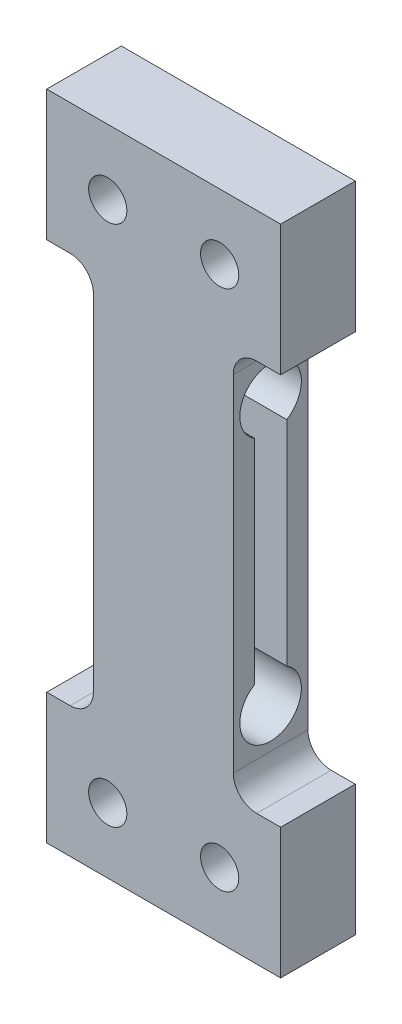
ISO-10303-21;
HEADER;
FILE_DESCRIPTION(('STEP AP214'),'2;1');
FILE_NAME('part.step','',(''),(''),'','','');
FILE_SCHEMA(('AUTOMOTIVE_DESIGN { 1 0 10303 214 1 1 1 1 }'));
ENDSEC;
DATA;
#1=APPLICATION_CONTEXT('core data for automotive mechanical design processes');
#2=APPLICATION_PROTOCOL_DEFINITION('international standard','automotive_design',2000,#1);
#3=PRODUCT_CONTEXT('',#1,'mechanical');
#4=PRODUCT('Part','Part','',(#3));
#5=PRODUCT_RELATED_PRODUCT_CATEGORY('part','',(#4));
#6=PRODUCT_DEFINITION_FORMATION('','',#4);
#7=PRODUCT_DEFINITION_CONTEXT('part definition',#1,'design');
#8=PRODUCT_DEFINITION('design','',#6,#7);
#9=PRODUCT_DEFINITION_SHAPE('','',#8);
#10=(LENGTH_UNIT() NAMED_UNIT(*) SI_UNIT(.MILLI.,.METRE.));
#11=(NAMED_UNIT(*) PLANE_ANGLE_UNIT() SI_UNIT($,.RADIAN.));
#12=(NAMED_UNIT(*) SI_UNIT($,.STERADIAN.) SOLID_ANGLE_UNIT());
#13=UNCERTAINTY_MEASURE_WITH_UNIT(LENGTH_MEASURE(1.E-05),#10,'distance_accuracy_value','');
#14=(GEOMETRIC_REPRESENTATION_CONTEXT(3) GLOBAL_UNCERTAINTY_ASSIGNED_CONTEXT((#13)) GLOBAL_UNIT_ASSIGNED_CONTEXT((#10,
#11,#12)) REPRESENTATION_CONTEXT('',''));
#15=CARTESIAN_POINT('',(0.,0.,0.));
#16=DIRECTION('',(0.,0.,1.));
#17=DIRECTION('',(1.,0.,0.));
#18=AXIS2_PLACEMENT_3D('',#15,#16,#17);
#19=CARTESIAN_POINT('',(2.53843426704407,0.,0.));
#20=DIRECTION('',(1.,0.,0.));
#21=DIRECTION('',(0.,0.,-1.));
#22=AXIS2_PLACEMENT_3D('',#19,#20,#21);
#23=PLANE('',#22);
#24=DIRECTION('',(0.,0.,-1.));
#25=VECTOR('',#24,1.);
#26=CARTESIAN_POINT('',(2.53843426704407,28.,4.));
#27=LINE('',#26,#25);
#28=CARTESIAN_POINT('',(2.53843426704407,28.,4.));
#29=VERTEX_POINT('',#28);
#30=CARTESIAN_POINT('',(2.53843426704407,28.,0.));
#31=VERTEX_POINT('',#30);
#32=EDGE_CURVE('E223',#29,#31,#27,.T.);
#33=ORIENTED_EDGE('',*,*,#32,.T.);
#34=DIRECTION('',(0.,1.,0.));
#35=VECTOR('',#34,1.);
#36=CARTESIAN_POINT('',(2.53843426704407,0.,0.));
#37=LINE('',#36,#35);
#38=CARTESIAN_POINT('',(2.53843426704407,35.,0.));
#39=VERTEX_POINT('',#38);
#40=EDGE_CURVE('E260',#31,#39,#37,.T.);
#41=ORIENTED_EDGE('',*,*,#40,.T.);
#42=DIRECTION('',(0.,0.,1.));
#43=VECTOR('',#42,1.);
#44=CARTESIAN_POINT('',(2.53843426704407,35.,0.));
#45=LINE('',#44,#43);
#46=CARTESIAN_POINT('',(2.53843426704407,35.,4.));
#47=VERTEX_POINT('',#46);
#48=EDGE_CURVE('E277',#39,#47,#45,.T.);
#49=ORIENTED_EDGE('',*,*,#48,.T.);
#50=DIRECTION('',(0.,1.,0.));
#51=VECTOR('',#50,1.);
#52=CARTESIAN_POINT('',(2.53843426704407,0.,4.));
#53=LINE('',#52,#51);
#54=EDGE_CURVE('E274',#29,#47,#53,.T.);
#55=ORIENTED_EDGE('',*,*,#54,.F.);
#56=EDGE_LOOP('',(#33,#41,#49,#55));
#57=FACE_BOUND('',#56,.T.);
#58=ADVANCED_FACE('F37',(#57),#23,.T.);
#59=CARTESIAN_POINT('',(-10.,35.,0.));
#60=DIRECTION('',(-1.,0.,0.));
#61=DIRECTION('',(0.,0.,1.));
#62=AXIS2_PLACEMENT_3D('',#59,#60,#61);
#63=PLANE('',#62);
#64=DIRECTION('',(0.,0.,-1.));
#65=VECTOR('',#64,1.);
#66=CARTESIAN_POINT('',(-10.,7.,4.));
#67=LINE('',#66,#65);
#68=CARTESIAN_POINT('',(-10.,7.,4.));
#69=VERTEX_POINT('',#68);
#70=CARTESIAN_POINT('',(-10.,7.,0.));
#71=VERTEX_POINT('',#70);
#72=EDGE_CURVE('E244',#69,#71,#67,.T.);
#73=ORIENTED_EDGE('',*,*,#72,.T.);
#74=DIRECTION('',(0.,-1.,0.));
#75=VECTOR('',#74,1.);
#76=CARTESIAN_POINT('',(-10.,35.,0.));
#77=LINE('',#76,#75);
#78=CARTESIAN_POINT('',(-10.,0.,0.));
#79=VERTEX_POINT('',#78);
#80=EDGE_CURVE('E252',#71,#79,#77,.T.);
#81=ORIENTED_EDGE('',*,*,#80,.T.);
#82=DIRECTION('',(0.,0.,1.));
#83=VECTOR('',#82,1.);
#84=CARTESIAN_POINT('',(-10.,0.,0.));
#85=LINE('',#84,#83);
#86=CARTESIAN_POINT('',(-10.,0.,4.));
#87=VERTEX_POINT('',#86);
#88=EDGE_CURVE('E283',#79,#87,#85,.T.);
#89=ORIENTED_EDGE('',*,*,#88,.T.);
#90=DIRECTION('',(0.,-1.,0.));
#91=VECTOR('',#90,1.);
#92=CARTESIAN_POINT('',(-10.,35.,4.));
#93=LINE('',#92,#91);
#94=EDGE_CURVE('E267',#69,#87,#93,.T.);
#95=ORIENTED_EDGE('',*,*,#94,.F.);
#96=EDGE_LOOP('',(#73,#81,#89,#95));
#97=FACE_BOUND('',#96,.T.);
#98=ADVANCED_FACE('F357',(#97),#63,.T.);
#99=CARTESIAN_POINT('',(2.53843426704407,35.,0.));
#100=DIRECTION('',(0.,1.,0.));
#101=DIRECTION('',(0.,0.,1.));
#102=AXIS2_PLACEMENT_3D('',#99,#100,#101);
#103=PLANE('',#102);
#104=DIRECTION('',(-1.,0.,0.));
#105=VECTOR('',#104,1.);
#106=CARTESIAN_POINT('',(2.53843426704407,35.,4.));
#107=LINE('',#106,#105);
#108=CARTESIAN_POINT('',(-10.,35.,4.));
#109=VERTEX_POINT('',#108);
#110=EDGE_CURVE('E247',#47,#109,#107,.T.);
#111=ORIENTED_EDGE('',*,*,#110,.F.);
#112=ORIENTED_EDGE('',*,*,#48,.F.);
#113=DIRECTION('',(-1.,0.,0.));
#114=VECTOR('',#113,1.);
#115=CARTESIAN_POINT('',(2.53843426704407,35.,0.));
#116=LINE('',#115,#114);
#117=CARTESIAN_POINT('',(-10.,35.,0.));
#118=VERTEX_POINT('',#117);
#119=EDGE_CURVE('E249',#39,#118,#116,.T.);
#120=ORIENTED_EDGE('',*,*,#119,.T.);
#121=DIRECTION('',(0.,0.,1.));
#122=VECTOR('',#121,1.);
#123=CARTESIAN_POINT('',(-10.,35.,0.));
#124=LINE('',#123,#122);
#125=EDGE_CURVE('E264',#118,#109,#124,.T.);
#126=ORIENTED_EDGE('',*,*,#125,.T.);
#127=EDGE_LOOP('',(#111,#112,#120,#126));
#128=FACE_BOUND('',#127,.T.);
#129=ADVANCED_FACE('F385',(#128),#103,.T.);
#130=DIRECTION('',(0.,0.,-1.));
#131=VECTOR('',#130,1.);
#132=CARTESIAN_POINT('',(2.53843426704407,7.,4.));
#133=LINE('',#132,#131);
#134=CARTESIAN_POINT('',(2.53843426704407,7.,4.));
#135=VERTEX_POINT('',#134);
#136=CARTESIAN_POINT('',(2.53843426704407,7.,0.));
#137=VERTEX_POINT('',#136);
#138=EDGE_CURVE('E217',#135,#137,#133,.T.);
#139=ORIENTED_EDGE('',*,*,#138,.F.);
#140=CARTESIAN_POINT('',(2.53843426704407,0.,4.));
#141=VERTEX_POINT('',#140);
#142=EDGE_CURVE('E253',#141,#135,#53,.T.);
#143=ORIENTED_EDGE('',*,*,#142,.F.);
#144=DIRECTION('',(0.,0.,1.));
#145=VECTOR('',#144,1.);
#146=CARTESIAN_POINT('',(2.53843426704407,0.,0.));
#147=LINE('',#146,#145);
#148=CARTESIAN_POINT('',(2.53843426704407,0.,0.));
#149=VERTEX_POINT('',#148);
#150=EDGE_CURVE('E281',#149,#141,#147,.T.);
#151=ORIENTED_EDGE('',*,*,#150,.F.);
#152=EDGE_CURVE('E261',#149,#137,#37,.T.);
#153=ORIENTED_EDGE('',*,*,#152,.T.);
#154=EDGE_LOOP('',(#139,#143,#151,#153));
#155=FACE_BOUND('',#154,.T.);
#156=ADVANCED_FACE('F346',(#155),#23,.T.);
#157=CARTESIAN_POINT('',(-10.,0.,0.));
#158=DIRECTION('',(0.,-1.,0.));
#159=DIRECTION('',(0.,0.,-1.));
#160=AXIS2_PLACEMENT_3D('',#157,#158,#159);
#161=PLANE('',#160);
#162=DIRECTION('',(1.,0.,0.));
#163=VECTOR('',#162,1.);
#164=CARTESIAN_POINT('',(-10.,0.,4.));
#165=LINE('',#164,#163);
#166=EDGE_CURVE('E271',#87,#141,#165,.T.);
#167=ORIENTED_EDGE('',*,*,#166,.F.);
#168=ORIENTED_EDGE('',*,*,#88,.F.);
#169=DIRECTION('',(1.,0.,0.));
#170=VECTOR('',#169,1.);
#171=CARTESIAN_POINT('',(-10.,0.,0.));
#172=LINE('',#171,#170);
#173=EDGE_CURVE('E257',#79,#149,#172,.T.);
#174=ORIENTED_EDGE('',*,*,#173,.T.);
#175=ORIENTED_EDGE('',*,*,#150,.T.);
#176=EDGE_LOOP('',(#167,#168,#174,#175));
#177=FACE_BOUND('',#176,.T.);
#178=ADVANCED_FACE('F354',(#177),#161,.T.);
#179=DIRECTION('',(0.,0.,-1.));
#180=VECTOR('',#179,1.);
#181=CARTESIAN_POINT('',(-10.,28.,4.));
#182=LINE('',#181,#180);
#183=CARTESIAN_POINT('',(-10.,28.,4.));
#184=VERTEX_POINT('',#183);
#185=CARTESIAN_POINT('',(-10.,28.,0.));
#186=VERTEX_POINT('',#185);
#187=EDGE_CURVE('E237',#184,#186,#182,.T.);
#188=ORIENTED_EDGE('',*,*,#187,.F.);
#189=EDGE_CURVE('E268',#109,#184,#93,.T.);
#190=ORIENTED_EDGE('',*,*,#189,.F.);
#191=ORIENTED_EDGE('',*,*,#125,.F.);
#192=EDGE_CURVE('E254',#118,#186,#77,.T.);
#193=ORIENTED_EDGE('',*,*,#192,.T.);
#194=EDGE_LOOP('',(#188,#190,#191,#193));
#195=FACE_BOUND('',#194,.T.);
#196=ADVANCED_FACE('F381',(#195),#63,.T.);
#197=CARTESIAN_POINT('',(-10.,35.,0.));
#198=DIRECTION('',(0.,0.,1.));
#199=DIRECTION('',(1.,0.,0.));
#200=AXIS2_PLACEMENT_3D('',#197,#198,#199);
#201=PLANE('',#200);
#202=CARTESIAN_POINT('',(-0.730782866478019,3.49999999999998,0.));
#203=DIRECTION('',(0.,0.,1.));
#204=DIRECTION('',(1.,0.,0.));
#205=AXIS2_PLACEMENT_3D('',#202,#203,#204);
#206=CIRCLE('',#205,1.025);
#207=CARTESIAN_POINT('',(0.29421713352198,3.49999999999998,0.));
#208=VERTEX_POINT('',#207);
#209=EDGE_CURVE('E631',#208,#208,#206,.T.);
#210=ORIENTED_EDGE('',*,*,#209,.T.);
#211=EDGE_LOOP('',(#210));
#212=FACE_BOUND('',#211,.T.);
#213=CARTESIAN_POINT('',(-6.73078286647802,3.5,0.));
#214=DIRECTION('',(0.,0.,1.));
#215=DIRECTION('',(1.,0.,0.));
#216=AXIS2_PLACEMENT_3D('',#213,#214,#215);
#217=CIRCLE('',#216,1.025);
#218=CARTESIAN_POINT('',(-5.70578286647802,3.5,0.));
#219=VERTEX_POINT('',#218);
#220=EDGE_CURVE('E625',#219,#219,#217,.T.);
#221=ORIENTED_EDGE('',*,*,#220,.T.);
#222=EDGE_LOOP('',(#221));
#223=FACE_BOUND('',#222,.T.);
#224=CARTESIAN_POINT('',(-0.730782866478016,31.5,0.));
#225=DIRECTION('',(0.,0.,1.));
#226=DIRECTION('',(1.,0.,0.));
#227=AXIS2_PLACEMENT_3D('',#224,#225,#226);
#228=CIRCLE('',#227,1.025);
#229=CARTESIAN_POINT('',(0.294217133521983,31.5,0.));
#230=VERTEX_POINT('',#229);
#231=EDGE_CURVE('E619',#230,#230,#228,.T.);
#232=ORIENTED_EDGE('',*,*,#231,.T.);
#233=EDGE_LOOP('',(#232));
#234=FACE_BOUND('',#233,.T.);
#235=CARTESIAN_POINT('',(-6.73078286647802,31.5,0.));
#236=DIRECTION('',(0.,0.,1.));
#237=DIRECTION('',(1.,0.,0.));
#238=AXIS2_PLACEMENT_3D('',#235,#236,#237);
#239=CIRCLE('',#238,1.025);
#240=CARTESIAN_POINT('',(-5.70578286647802,31.5,0.));
#241=VERTEX_POINT('',#240);
#242=EDGE_CURVE('E195',#241,#241,#239,.T.);
#243=ORIENTED_EDGE('',*,*,#242,.T.);
#244=EDGE_LOOP('',(#243));
#245=FACE_BOUND('',#244,.T.);
#246=ORIENTED_EDGE('',*,*,#40,.F.);
#247=DIRECTION('',(1.,0.,0.));
#248=VECTOR('',#247,1.);
#249=CARTESIAN_POINT('',(0.,28.,0.));
#250=LINE('',#249,#248);
#251=CARTESIAN_POINT('',(1.25,28.,0.));
#252=VERTEX_POINT('',#251);
#253=EDGE_CURVE('E212',#252,#31,#250,.T.);
#254=ORIENTED_EDGE('',*,*,#253,.F.);
#255=CARTESIAN_POINT('',(1.25,26.75,0.));
#256=DIRECTION('',(0.,0.,1.));
#257=DIRECTION('',(1.,0.,0.));
#258=AXIS2_PLACEMENT_3D('',#255,#256,#257);
#259=CIRCLE('',#258,1.25);
#260=CARTESIAN_POINT('',(0.,26.75,0.));
#261=VERTEX_POINT('',#260);
#262=EDGE_CURVE('E318',#252,#261,#259,.T.);
#263=ORIENTED_EDGE('',*,*,#262,.T.);
#264=DIRECTION('',(0.,1.,0.));
#265=VECTOR('',#264,1.);
#266=CARTESIAN_POINT('',(0.,6.99999999999999,0.));
#267=LINE('',#266,#265);
#268=CARTESIAN_POINT('',(0.,8.24999999999999,0.));
#269=VERTEX_POINT('',#268);
#270=EDGE_CURVE('E219',#269,#261,#267,.T.);
#271=ORIENTED_EDGE('',*,*,#270,.F.);
#272=CARTESIAN_POINT('',(1.25,8.24999999999999,0.));
#273=DIRECTION('',(0.,0.,1.));
#274=DIRECTION('',(1.,0.,0.));
#275=AXIS2_PLACEMENT_3D('',#272,#273,#274);
#276=CIRCLE('',#275,1.25);
#277=CARTESIAN_POINT('',(1.25,7.,0.));
#278=VERTEX_POINT('',#277);
#279=EDGE_CURVE('E45',#269,#278,#276,.T.);
#280=ORIENTED_EDGE('',*,*,#279,.T.);
#281=DIRECTION('',(-1.,0.,0.));
#282=VECTOR('',#281,1.);
#283=CARTESIAN_POINT('',(2.53843426704407,7.,0.));
#284=LINE('',#283,#282);
#285=EDGE_CURVE('E183',#137,#278,#284,.T.);
#286=ORIENTED_EDGE('',*,*,#285,.F.);
#287=ORIENTED_EDGE('',*,*,#152,.F.);
#288=ORIENTED_EDGE('',*,*,#173,.F.);
#289=ORIENTED_EDGE('',*,*,#80,.F.);
#290=DIRECTION('',(-1.,0.,0.));
#291=VECTOR('',#290,1.);
#292=CARTESIAN_POINT('',(-7.5,6.99999999999999,0.));
#293=LINE('',#292,#291);
#294=CARTESIAN_POINT('',(-8.75000000000001,6.99999999999999,0.));
#295=VERTEX_POINT('',#294);
#296=EDGE_CURVE('E232',#295,#71,#293,.T.);
#297=ORIENTED_EDGE('',*,*,#296,.F.);
#298=CARTESIAN_POINT('',(-8.75,8.24999999999999,0.));
#299=DIRECTION('',(0.,0.,1.));
#300=DIRECTION('',(1.,0.,0.));
#301=AXIS2_PLACEMENT_3D('',#298,#299,#300);
#302=CIRCLE('',#301,1.25);
#303=CARTESIAN_POINT('',(-7.5,8.24999999999999,0.));
#304=VERTEX_POINT('',#303);
#305=EDGE_CURVE('E314',#295,#304,#302,.T.);
#306=ORIENTED_EDGE('',*,*,#305,.T.);
#307=DIRECTION('',(0.,-1.,0.));
#308=VECTOR('',#307,1.);
#309=CARTESIAN_POINT('',(-7.5,28.,0.));
#310=LINE('',#309,#308);
#311=CARTESIAN_POINT('',(-7.5,26.75,0.));
#312=VERTEX_POINT('',#311);
#313=EDGE_CURVE('E240',#312,#304,#310,.T.);
#314=ORIENTED_EDGE('',*,*,#313,.F.);
#315=CARTESIAN_POINT('',(-8.75,26.75,0.));
#316=DIRECTION('',(0.,0.,1.));
#317=DIRECTION('',(1.,0.,0.));
#318=AXIS2_PLACEMENT_3D('',#315,#316,#317);
#319=CIRCLE('',#318,1.25);
#320=CARTESIAN_POINT('',(-8.74999999999999,28.,0.));
#321=VERTEX_POINT('',#320);
#322=EDGE_CURVE('E310',#312,#321,#319,.T.);
#323=ORIENTED_EDGE('',*,*,#322,.T.);
#324=DIRECTION('',(1.,0.,0.));
#325=VECTOR('',#324,1.);
#326=CARTESIAN_POINT('',(-10.,28.,0.));
#327=LINE('',#326,#325);
#328=EDGE_CURVE('E226',#186,#321,#327,.T.);
#329=ORIENTED_EDGE('',*,*,#328,.F.);
#330=ORIENTED_EDGE('',*,*,#192,.F.);
#331=ORIENTED_EDGE('',*,*,#119,.F.);
#332=EDGE_LOOP('',(#246,#254,#263,#271,#280,#286,#287,#288,#289,#297,#306,#314,#323,#329,#330,#331));
#333=FACE_BOUND('',#332,.T.);
#334=ADVANCED_FACE('F336',(#212,#223,#234,#245,#333),#201,.F.);
#335=CARTESIAN_POINT('',(-10.,35.,4.));
#336=DIRECTION('',(0.,0.,1.));
#337=DIRECTION('',(1.,0.,0.));
#338=AXIS2_PLACEMENT_3D('',#335,#336,#337);
#339=PLANE('',#338);
#340=CARTESIAN_POINT('',(-0.730782866478019,3.49999999999998,4.));
#341=DIRECTION('',(0.,0.,1.));
#342=DIRECTION('',(1.,0.,0.));
#343=AXIS2_PLACEMENT_3D('',#340,#341,#342);
#344=CIRCLE('',#343,1.02499999999999);
#345=CARTESIAN_POINT('',(0.294217133521969,3.49999999999998,4.));
#346=VERTEX_POINT('',#345);
#347=EDGE_CURVE('E634',#346,#346,#344,.T.);
#348=ORIENTED_EDGE('',*,*,#347,.F.);
#349=EDGE_LOOP('',(#348));
#350=FACE_BOUND('',#349,.T.);
#351=CARTESIAN_POINT('',(-6.73078286647802,3.5,4.));
#352=DIRECTION('',(0.,0.,1.));
#353=DIRECTION('',(1.,0.,0.));
#354=AXIS2_PLACEMENT_3D('',#351,#352,#353);
#355=CIRCLE('',#354,1.02499999999999);
#356=CARTESIAN_POINT('',(-5.70578286647803,3.5,4.));
#357=VERTEX_POINT('',#356);
#358=EDGE_CURVE('E628',#357,#357,#355,.T.);
#359=ORIENTED_EDGE('',*,*,#358,.F.);
#360=EDGE_LOOP('',(#359));
#361=FACE_BOUND('',#360,.T.);
#362=CARTESIAN_POINT('',(-0.730782866478016,31.5,4.));
#363=DIRECTION('',(0.,0.,1.));
#364=DIRECTION('',(1.,0.,0.));
#365=AXIS2_PLACEMENT_3D('',#362,#363,#364);
#366=CIRCLE('',#365,1.02499999999999);
#367=CARTESIAN_POINT('',(0.294217133521972,31.5,4.));
#368=VERTEX_POINT('',#367);
#369=EDGE_CURVE('E622',#368,#368,#366,.T.);
#370=ORIENTED_EDGE('',*,*,#369,.F.);
#371=EDGE_LOOP('',(#370));
#372=FACE_BOUND('',#371,.T.);
#373=CARTESIAN_POINT('',(-6.73078286647802,31.5,4.));
#374=DIRECTION('',(0.,0.,1.));
#375=DIRECTION('',(1.,0.,0.));
#376=AXIS2_PLACEMENT_3D('',#373,#374,#375);
#377=CIRCLE('',#376,1.02499999999999);
#378=CARTESIAN_POINT('',(-5.70578286647803,31.5,4.));
#379=VERTEX_POINT('',#378);
#380=EDGE_CURVE('E616',#379,#379,#377,.T.);
#381=ORIENTED_EDGE('',*,*,#380,.F.);
#382=EDGE_LOOP('',(#381));
#383=FACE_BOUND('',#382,.T.);
#384=DIRECTION('',(0.,1.,0.));
#385=VECTOR('',#384,1.);
#386=CARTESIAN_POINT('',(0.,6.99999999999999,4.));
#387=LINE('',#386,#385);
#388=CARTESIAN_POINT('',(0.,8.24999999999999,4.));
#389=VERTEX_POINT('',#388);
#390=CARTESIAN_POINT('',(0.,26.75,4.));
#391=VERTEX_POINT('',#390);
#392=EDGE_CURVE('E211',#389,#391,#387,.T.);
#393=ORIENTED_EDGE('',*,*,#392,.T.);
#394=CARTESIAN_POINT('',(1.25,26.75,4.));
#395=DIRECTION('',(0.,0.,1.));
#396=DIRECTION('',(1.,0.,0.));
#397=AXIS2_PLACEMENT_3D('',#394,#395,#396);
#398=CIRCLE('',#397,1.25);
#399=CARTESIAN_POINT('',(1.25,28.,4.));
#400=VERTEX_POINT('',#399);
#401=EDGE_CURVE('E320',#391,#400,#398,.F.);
#402=ORIENTED_EDGE('',*,*,#401,.T.);
#403=DIRECTION('',(1.,0.,0.));
#404=VECTOR('',#403,1.);
#405=CARTESIAN_POINT('',(0.,28.,4.));
#406=LINE('',#405,#404);
#407=EDGE_CURVE('E215',#400,#29,#406,.T.);
#408=ORIENTED_EDGE('',*,*,#407,.T.);
#409=ORIENTED_EDGE('',*,*,#54,.T.);
#410=ORIENTED_EDGE('',*,*,#110,.T.);
#411=ORIENTED_EDGE('',*,*,#189,.T.);
#412=DIRECTION('',(1.,0.,0.));
#413=VECTOR('',#412,1.);
#414=CARTESIAN_POINT('',(-10.,28.,4.));
#415=LINE('',#414,#413);
#416=CARTESIAN_POINT('',(-8.74999999999999,28.,4.));
#417=VERTEX_POINT('',#416);
#418=EDGE_CURVE('E228',#184,#417,#415,.T.);
#419=ORIENTED_EDGE('',*,*,#418,.T.);
#420=CARTESIAN_POINT('',(-8.75,26.75,4.));
#421=DIRECTION('',(0.,0.,1.));
#422=DIRECTION('',(1.,0.,0.));
#423=AXIS2_PLACEMENT_3D('',#420,#421,#422);
#424=CIRCLE('',#423,1.25);
#425=CARTESIAN_POINT('',(-7.5,26.75,4.));
#426=VERTEX_POINT('',#425);
#427=EDGE_CURVE('E312',#417,#426,#424,.F.);
#428=ORIENTED_EDGE('',*,*,#427,.T.);
#429=DIRECTION('',(0.,-1.,0.));
#430=VECTOR('',#429,1.);
#431=CARTESIAN_POINT('',(-7.5,28.,4.));
#432=LINE('',#431,#430);
#433=CARTESIAN_POINT('',(-7.5,8.24999999999999,4.));
#434=VERTEX_POINT('',#433);
#435=EDGE_CURVE('E231',#426,#434,#432,.T.);
#436=ORIENTED_EDGE('',*,*,#435,.T.);
#437=CARTESIAN_POINT('',(-8.75,8.24999999999999,4.));
#438=DIRECTION('',(0.,0.,1.));
#439=DIRECTION('',(1.,0.,0.));
#440=AXIS2_PLACEMENT_3D('',#437,#438,#439);
#441=CIRCLE('',#440,1.25);
#442=CARTESIAN_POINT('',(-8.75000000000001,6.99999999999999,4.));
#443=VERTEX_POINT('',#442);
#444=EDGE_CURVE('E316',#434,#443,#441,.F.);
#445=ORIENTED_EDGE('',*,*,#444,.T.);
#446=DIRECTION('',(-1.,0.,0.));
#447=VECTOR('',#446,1.);
#448=CARTESIAN_POINT('',(-7.5,6.99999999999999,4.));
#449=LINE('',#448,#447);
#450=EDGE_CURVE('E235',#443,#69,#449,.T.);
#451=ORIENTED_EDGE('',*,*,#450,.T.);
#452=ORIENTED_EDGE('',*,*,#94,.T.);
#453=ORIENTED_EDGE('',*,*,#166,.T.);
#454=ORIENTED_EDGE('',*,*,#142,.T.);
#455=DIRECTION('',(-1.,0.,0.));
#456=VECTOR('',#455,1.);
#457=CARTESIAN_POINT('',(2.53843426704407,7.,4.));
#458=LINE('',#457,#456);
#459=CARTESIAN_POINT('',(1.25,7.,4.));
#460=VERTEX_POINT('',#459);
#461=EDGE_CURVE('E209',#135,#460,#458,.T.);
#462=ORIENTED_EDGE('',*,*,#461,.T.);
#463=CARTESIAN_POINT('',(1.25,8.24999999999999,4.));
#464=DIRECTION('',(0.,0.,1.));
#465=DIRECTION('',(1.,0.,0.));
#466=AXIS2_PLACEMENT_3D('',#463,#464,#465);
#467=CIRCLE('',#466,1.25);
#468=EDGE_CURVE('E11',#460,#389,#467,.F.);
#469=ORIENTED_EDGE('',*,*,#468,.T.);
#470=EDGE_LOOP('',(#393,#402,#408,#409,#410,#411,#419,#428,#436,#445,#451,#452,#453,#454,#462,#469));
#471=FACE_BOUND('',#470,.T.);
#472=ADVANCED_FACE('F324',(#350,#361,#372,#383,#471),#339,.T.);
#473=CARTESIAN_POINT('',(-7.5,6.99999999999999,4.));
#474=DIRECTION('',(0.,-1.,0.));
#475=DIRECTION('',(1.,0.,0.));
#476=AXIS2_PLACEMENT_3D('',#473,#474,#475);
#477=PLANE('',#476);
#478=ORIENTED_EDGE('',*,*,#450,.F.);
#479=DIRECTION('',(0.,0.,-1.));
#480=VECTOR('',#479,1.);
#481=CARTESIAN_POINT('',(-8.75000000000001,6.99999999999999,0.));
#482=LINE('',#481,#480);
#483=EDGE_CURVE('E298',#443,#295,#482,.T.);
#484=ORIENTED_EDGE('',*,*,#483,.T.);
#485=ORIENTED_EDGE('',*,*,#296,.T.);
#486=ORIENTED_EDGE('',*,*,#72,.F.);
#487=EDGE_LOOP('',(#478,#484,#485,#486));
#488=FACE_BOUND('',#487,.T.);
#489=ADVANCED_FACE('F361',(#488),#477,.F.);
#490=CARTESIAN_POINT('',(-7.5,28.,4.));
#491=DIRECTION('',(1.,0.,0.));
#492=DIRECTION('',(0.,1.,0.));
#493=AXIS2_PLACEMENT_3D('',#490,#491,#492);
#494=PLANE('',#493);
#495=DIRECTION('',(0.,1.,0.));
#496=VECTOR('',#495,1.);
#497=CARTESIAN_POINT('',(-7.5,11.7856301404825,2.85593376306963));
#498=LINE('',#497,#496);
#499=CARTESIAN_POINT('',(-7.5,11.7856301404825,2.85593376306963));
#500=VERTEX_POINT('',#499);
#501=CARTESIAN_POINT('',(-7.5,23.2143698595176,2.85593376306961));
#502=VERTEX_POINT('',#501);
#503=EDGE_CURVE('E194',#500,#502,#498,.T.);
#504=ORIENTED_EDGE('',*,*,#503,.F.);
#505=CARTESIAN_POINT('',(-7.5,10.375,2.));
#506=DIRECTION('',(-1.,0.,0.));
#507=DIRECTION('',(0.,0.,1.));
#508=AXIS2_PLACEMENT_3D('',#505,#506,#507);
#509=CIRCLE('',#508,1.65000000000002);
#510=CARTESIAN_POINT('',(-7.5,11.7781326807042,1.13183026985506));
#511=VERTEX_POINT('',#510);
#512=EDGE_CURVE('E175',#511,#500,#509,.T.);
#513=ORIENTED_EDGE('',*,*,#512,.F.);
#514=DIRECTION('',(0.,-1.,0.));
#515=VECTOR('',#514,1.);
#516=CARTESIAN_POINT('',(-7.5,23.2218673192958,1.13183026985509));
#517=LINE('',#516,#515);
#518=CARTESIAN_POINT('',(-7.5,23.2218673192958,1.13183026985507));
#519=VERTEX_POINT('',#518);
#520=EDGE_CURVE('E192',#519,#511,#517,.T.);
#521=ORIENTED_EDGE('',*,*,#520,.F.);
#522=CARTESIAN_POINT('',(-7.5,24.625,2.));
#523=DIRECTION('',(-1.,0.,0.));
#524=DIRECTION('',(0.,0.,1.));
#525=AXIS2_PLACEMENT_3D('',#522,#523,#524);
#526=CIRCLE('',#525,1.65000000000001);
#527=EDGE_CURVE('E609',#502,#519,#526,.T.);
#528=ORIENTED_EDGE('',*,*,#527,.F.);
#529=EDGE_LOOP('',(#504,#513,#521,#528));
#530=FACE_BOUND('',#529,.T.);
#531=ORIENTED_EDGE('',*,*,#435,.F.);
#532=DIRECTION('',(0.,0.,-1.));
#533=VECTOR('',#532,1.);
#534=CARTESIAN_POINT('',(-7.5,26.75,0.));
#535=LINE('',#534,#533);
#536=EDGE_CURVE('E293',#426,#312,#535,.T.);
#537=ORIENTED_EDGE('',*,*,#536,.T.);
#538=ORIENTED_EDGE('',*,*,#313,.T.);
#539=DIRECTION('',(0.,0.,-1.));
#540=VECTOR('',#539,1.);
#541=CARTESIAN_POINT('',(-7.5,8.24999999999999,4.));
#542=LINE('',#541,#540);
#543=EDGE_CURVE('E291',#304,#434,#542,.F.);
#544=ORIENTED_EDGE('',*,*,#543,.T.);
#545=EDGE_LOOP('',(#531,#537,#538,#544));
#546=FACE_BOUND('',#545,.T.);
#547=ADVANCED_FACE('F189',(#530,#546),#494,.F.);
#548=CARTESIAN_POINT('',(-10.,28.,4.));
#549=DIRECTION('',(0.,1.,0.));
#550=DIRECTION('',(-1.,0.,0.));
#551=AXIS2_PLACEMENT_3D('',#548,#549,#550);
#552=PLANE('',#551);
#553=ORIENTED_EDGE('',*,*,#328,.T.);
#554=DIRECTION('',(0.,0.,-1.));
#555=VECTOR('',#554,1.);
#556=CARTESIAN_POINT('',(-8.74999999999999,28.,4.));
#557=LINE('',#556,#555);
#558=EDGE_CURVE('E296',#321,#417,#557,.F.);
#559=ORIENTED_EDGE('',*,*,#558,.T.);
#560=ORIENTED_EDGE('',*,*,#418,.F.);
#561=ORIENTED_EDGE('',*,*,#187,.T.);
#562=EDGE_LOOP('',(#553,#559,#560,#561));
#563=FACE_BOUND('',#562,.T.);
#564=ADVANCED_FACE('F377',(#563),#552,.F.);
#565=CARTESIAN_POINT('',(0.,28.,4.));
#566=DIRECTION('',(0.,1.,0.));
#567=DIRECTION('',(-1.,0.,0.));
#568=AXIS2_PLACEMENT_3D('',#565,#566,#567);
#569=PLANE('',#568);
#570=ORIENTED_EDGE('',*,*,#407,.F.);
#571=DIRECTION('',(0.,0.,-1.));
#572=VECTOR('',#571,1.);
#573=CARTESIAN_POINT('',(1.25,28.,0.));
#574=LINE('',#573,#572);
#575=EDGE_CURVE('E301',#400,#252,#574,.T.);
#576=ORIENTED_EDGE('',*,*,#575,.T.);
#577=ORIENTED_EDGE('',*,*,#253,.T.);
#578=ORIENTED_EDGE('',*,*,#32,.F.);
#579=EDGE_LOOP('',(#570,#576,#577,#578));
#580=FACE_BOUND('',#579,.T.);
#581=ADVANCED_FACE('F331',(#580),#569,.F.);
#582=CARTESIAN_POINT('',(0.,6.99999999999999,4.));
#583=DIRECTION('',(-1.,0.,0.));
#584=DIRECTION('',(0.,-1.,0.));
#585=AXIS2_PLACEMENT_3D('',#582,#583,#584);
#586=PLANE('',#585);
#587=DIRECTION('',(0.,-1.,0.));
#588=VECTOR('',#587,1.);
#589=CARTESIAN_POINT('',(0.,7.,1.13183026985505));
#590=LINE('',#589,#588);
#591=CARTESIAN_POINT('',(0.,23.2218673192958,1.13183026985506));
#592=VERTEX_POINT('',#591);
#593=CARTESIAN_POINT('',(0.,11.7781326807042,1.13183026985506));
#594=VERTEX_POINT('',#593);
#595=EDGE_CURVE('E289',#592,#594,#590,.T.);
#596=ORIENTED_EDGE('',*,*,#595,.T.);
#597=CARTESIAN_POINT('',(0.,10.375,2.));
#598=DIRECTION('',(-1.,0.,0.));
#599=DIRECTION('',(0.,0.,1.));
#600=AXIS2_PLACEMENT_3D('',#597,#598,#599);
#601=CIRCLE('',#600,1.64999999999999);
#602=CARTESIAN_POINT('',(0.,11.7856301404824,2.85593376306963));
#603=VERTEX_POINT('',#602);
#604=EDGE_CURVE('E178',#594,#603,#601,.T.);
#605=ORIENTED_EDGE('',*,*,#604,.T.);
#606=DIRECTION('',(0.,1.,0.));
#607=VECTOR('',#606,1.);
#608=CARTESIAN_POINT('',(0.,6.99999999999999,2.85593376306963));
#609=LINE('',#608,#607);
#610=CARTESIAN_POINT('',(0.,23.2143698595176,2.85593376306961));
#611=VERTEX_POINT('',#610);
#612=EDGE_CURVE('E280',#603,#611,#609,.T.);
#613=ORIENTED_EDGE('',*,*,#612,.T.);
#614=CARTESIAN_POINT('',(0.,24.625,2.));
#615=DIRECTION('',(-1.,0.,0.));
#616=DIRECTION('',(0.,0.,1.));
#617=AXIS2_PLACEMENT_3D('',#614,#615,#616);
#618=CIRCLE('',#617,1.65000000000003);
#619=EDGE_CURVE('E203',#611,#592,#618,.T.);
#620=ORIENTED_EDGE('',*,*,#619,.T.);
#621=EDGE_LOOP('',(#596,#605,#613,#620));
#622=FACE_BOUND('',#621,.T.);
#623=ORIENTED_EDGE('',*,*,#270,.T.);
#624=DIRECTION('',(0.,0.,-1.));
#625=VECTOR('',#624,1.);
#626=CARTESIAN_POINT('',(0.,26.75,4.));
#627=LINE('',#626,#625);
#628=EDGE_CURVE('E307',#261,#391,#627,.F.);
#629=ORIENTED_EDGE('',*,*,#628,.T.);
#630=ORIENTED_EDGE('',*,*,#392,.F.);
#631=DIRECTION('',(0.,0.,-1.));
#632=VECTOR('',#631,1.);
#633=CARTESIAN_POINT('',(0.,8.24999999999999,0.));
#634=LINE('',#633,#632);
#635=EDGE_CURVE('E304',#389,#269,#634,.T.);
#636=ORIENTED_EDGE('',*,*,#635,.T.);
#637=EDGE_LOOP('',(#623,#629,#630,#636));
#638=FACE_BOUND('',#637,.T.);
#639=ADVANCED_FACE('F338',(#622,#638),#586,.F.);
#640=CARTESIAN_POINT('',(2.53843426704407,7.,4.));
#641=DIRECTION('',(0.,-1.,0.));
#642=DIRECTION('',(1.,0.,0.));
#643=AXIS2_PLACEMENT_3D('',#640,#641,#642);
#644=PLANE('',#643);
#645=ORIENTED_EDGE('',*,*,#285,.T.);
#646=DIRECTION('',(0.,0.,-1.));
#647=VECTOR('',#646,1.);
#648=CARTESIAN_POINT('',(1.25,7.,4.));
#649=LINE('',#648,#647);
#650=EDGE_CURVE('E52',#278,#460,#649,.F.);
#651=ORIENTED_EDGE('',*,*,#650,.T.);
#652=ORIENTED_EDGE('',*,*,#461,.F.);
#653=ORIENTED_EDGE('',*,*,#138,.T.);
#654=EDGE_LOOP('',(#645,#651,#652,#653));
#655=FACE_BOUND('',#654,.T.);
#656=ADVANCED_FACE('F344',(#655),#644,.F.);
#657=CARTESIAN_POINT('',(2.53843426704407,23.2218673192958,1.13183026985509));
#658=DIRECTION('',(0.,0.,-1.));
#659=DIRECTION('',(0.,1.,0.));
#660=AXIS2_PLACEMENT_3D('',#657,#658,#659);
#661=PLANE('',#660);
#662=DIRECTION('',(-1.,0.,0.));
#663=VECTOR('',#662,1.);
#664=CARTESIAN_POINT('',(2.53843426704407,23.2218673192958,1.13183026985509));
#665=LINE('',#664,#663);
#666=EDGE_CURVE('E184',#592,#519,#665,.T.);
#667=ORIENTED_EDGE('',*,*,#666,.T.);
#668=ORIENTED_EDGE('',*,*,#520,.T.);
#669=DIRECTION('',(-1.,0.,0.));
#670=VECTOR('',#669,1.);
#671=CARTESIAN_POINT('',(2.53843426704407,11.7781326807042,1.13183026985506));
#672=LINE('',#671,#670);
#673=EDGE_CURVE('E172',#594,#511,#672,.T.);
#674=ORIENTED_EDGE('',*,*,#673,.F.);
#675=ORIENTED_EDGE('',*,*,#595,.F.);
#676=EDGE_LOOP('',(#667,#668,#674,#675));
#677=FACE_BOUND('',#676,.T.);
#678=ADVANCED_FACE('F198',(#677),#661,.F.);
#679=CARTESIAN_POINT('',(2.53843426704407,11.7856301404825,2.85593376306963));
#680=DIRECTION('',(0.,0.,1.));
#681=DIRECTION('',(0.,-1.,0.));
#682=AXIS2_PLACEMENT_3D('',#679,#680,#681);
#683=PLANE('',#682);
#684=DIRECTION('',(-1.,0.,0.));
#685=VECTOR('',#684,1.);
#686=CARTESIAN_POINT('',(2.53843426704407,11.7856301404825,2.85593376306963));
#687=LINE('',#686,#685);
#688=EDGE_CURVE('E199',#603,#500,#687,.T.);
#689=ORIENTED_EDGE('',*,*,#688,.T.);
#690=ORIENTED_EDGE('',*,*,#503,.T.);
#691=DIRECTION('',(-1.,0.,0.));
#692=VECTOR('',#691,1.);
#693=CARTESIAN_POINT('',(2.53843426704408,23.2143698595176,2.85593376306961));
#694=LINE('',#693,#692);
#695=EDGE_CURVE('E201',#611,#502,#694,.T.);
#696=ORIENTED_EDGE('',*,*,#695,.F.);
#697=ORIENTED_EDGE('',*,*,#612,.F.);
#698=EDGE_LOOP('',(#689,#690,#696,#697));
#699=FACE_BOUND('',#698,.T.);
#700=ADVANCED_FACE('F558',(#699),#683,.F.);
#701=CARTESIAN_POINT('',(0.,24.625,2.));
#702=DIRECTION('',(-1.,0.,0.));
#703=DIRECTION('',(0.,0.,1.));
#704=AXIS2_PLACEMENT_3D('',#701,#702,#703);
#705=CYLINDRICAL_SURFACE('',#704,1.65000000000002);
#706=ORIENTED_EDGE('',*,*,#619,.F.);
#707=ORIENTED_EDGE('',*,*,#695,.T.);
#708=ORIENTED_EDGE('',*,*,#527,.T.);
#709=ORIENTED_EDGE('',*,*,#666,.F.);
#710=EDGE_LOOP('',(#706,#707,#708,#709));
#711=FACE_BOUND('',#710,.T.);
#712=ADVANCED_FACE('F551',(#711),#705,.F.);
#713=CARTESIAN_POINT('',(0.,10.375,2.));
#714=DIRECTION('',(-1.,0.,0.));
#715=DIRECTION('',(0.,0.,1.));
#716=AXIS2_PLACEMENT_3D('',#713,#714,#715);
#717=CYLINDRICAL_SURFACE('',#716,1.65000000000001);
#718=ORIENTED_EDGE('',*,*,#512,.T.);
#719=ORIENTED_EDGE('',*,*,#688,.F.);
#720=ORIENTED_EDGE('',*,*,#604,.F.);
#721=ORIENTED_EDGE('',*,*,#673,.T.);
#722=EDGE_LOOP('',(#718,#719,#720,#721));
#723=FACE_BOUND('',#722,.T.);
#724=ADVANCED_FACE('F174',(#723),#717,.F.);
#725=CARTESIAN_POINT('',(-6.73078286647802,31.5,4.));
#726=DIRECTION('',(0.,0.,1.));
#727=DIRECTION('',(1.,0.,0.));
#728=AXIS2_PLACEMENT_3D('',#725,#726,#727);
#729=CYLINDRICAL_SURFACE('',#728,1.02499999999999);
#730=ORIENTED_EDGE('',*,*,#242,.F.);
#731=EDGE_LOOP('',(#730));
#732=FACE_BOUND('',#731,.T.);
#733=ORIENTED_EDGE('',*,*,#380,.T.);
#734=EDGE_LOOP('',(#733));
#735=FACE_BOUND('',#734,.T.);
#736=ADVANCED_FACE('F532',(#732,#735),#729,.F.);
#737=CARTESIAN_POINT('',(-0.730782866478016,31.5,4.));
#738=DIRECTION('',(0.,0.,1.));
#739=DIRECTION('',(1.,0.,0.));
#740=AXIS2_PLACEMENT_3D('',#737,#738,#739);
#741=CYLINDRICAL_SURFACE('',#740,1.02499999999999);
#742=ORIENTED_EDGE('',*,*,#231,.F.);
#743=EDGE_LOOP('',(#742));
#744=FACE_BOUND('',#743,.T.);
#745=ORIENTED_EDGE('',*,*,#369,.T.);
#746=EDGE_LOOP('',(#745));
#747=FACE_BOUND('',#746,.T.);
#748=ADVANCED_FACE('F522',(#744,#747),#741,.F.);
#749=CARTESIAN_POINT('',(-6.73078286647802,3.5,4.));
#750=DIRECTION('',(0.,0.,1.));
#751=DIRECTION('',(1.,0.,0.));
#752=AXIS2_PLACEMENT_3D('',#749,#750,#751);
#753=CYLINDRICAL_SURFACE('',#752,1.02499999999999);
#754=ORIENTED_EDGE('',*,*,#220,.F.);
#755=EDGE_LOOP('',(#754));
#756=FACE_BOUND('',#755,.T.);
#757=ORIENTED_EDGE('',*,*,#358,.T.);
#758=EDGE_LOOP('',(#757));
#759=FACE_BOUND('',#758,.T.);
#760=ADVANCED_FACE('F512',(#756,#759),#753,.F.);
#761=CARTESIAN_POINT('',(-0.730782866478019,3.49999999999998,4.));
#762=DIRECTION('',(0.,0.,1.));
#763=DIRECTION('',(1.,0.,0.));
#764=AXIS2_PLACEMENT_3D('',#761,#762,#763);
#765=CYLINDRICAL_SURFACE('',#764,1.02499999999999);
#766=ORIENTED_EDGE('',*,*,#209,.F.);
#767=EDGE_LOOP('',(#766));
#768=FACE_BOUND('',#767,.T.);
#769=ORIENTED_EDGE('',*,*,#347,.T.);
#770=EDGE_LOOP('',(#769));
#771=FACE_BOUND('',#770,.T.);
#772=ADVANCED_FACE('F407',(#768,#771),#765,.F.);
#773=CARTESIAN_POINT('',(-8.75,26.75,4.));
#774=DIRECTION('',(0.,0.,1.));
#775=DIRECTION('',(1.,0.,0.));
#776=AXIS2_PLACEMENT_3D('',#773,#774,#775);
#777=CYLINDRICAL_SURFACE('',#776,1.25);
#778=ORIENTED_EDGE('',*,*,#427,.F.);
#779=ORIENTED_EDGE('',*,*,#558,.F.);
#780=ORIENTED_EDGE('',*,*,#322,.F.);
#781=ORIENTED_EDGE('',*,*,#536,.F.);
#782=EDGE_LOOP('',(#778,#779,#780,#781));
#783=FACE_BOUND('',#782,.T.);
#784=ADVANCED_FACE('F372',(#783),#777,.F.);
#785=CARTESIAN_POINT('',(-8.75,8.24999999999999,4.));
#786=DIRECTION('',(0.,0.,1.));
#787=DIRECTION('',(1.,0.,0.));
#788=AXIS2_PLACEMENT_3D('',#785,#786,#787);
#789=CYLINDRICAL_SURFACE('',#788,1.25);
#790=ORIENTED_EDGE('',*,*,#444,.F.);
#791=ORIENTED_EDGE('',*,*,#543,.F.);
#792=ORIENTED_EDGE('',*,*,#305,.F.);
#793=ORIENTED_EDGE('',*,*,#483,.F.);
#794=EDGE_LOOP('',(#790,#791,#792,#793));
#795=FACE_BOUND('',#794,.T.);
#796=ADVANCED_FACE('F369',(#795),#789,.F.);
#797=CARTESIAN_POINT('',(1.25,26.75,4.));
#798=DIRECTION('',(0.,0.,1.));
#799=DIRECTION('',(1.,0.,0.));
#800=AXIS2_PLACEMENT_3D('',#797,#798,#799);
#801=CYLINDRICAL_SURFACE('',#800,1.25);
#802=ORIENTED_EDGE('',*,*,#401,.F.);
#803=ORIENTED_EDGE('',*,*,#628,.F.);
#804=ORIENTED_EDGE('',*,*,#262,.F.);
#805=ORIENTED_EDGE('',*,*,#575,.F.);
#806=EDGE_LOOP('',(#802,#803,#804,#805));
#807=FACE_BOUND('',#806,.T.);
#808=ADVANCED_FACE('F334',(#807),#801,.F.);
#809=CARTESIAN_POINT('',(1.25,8.24999999999999,4.));
#810=DIRECTION('',(0.,0.,1.));
#811=DIRECTION('',(1.,0.,0.));
#812=AXIS2_PLACEMENT_3D('',#809,#810,#811);
#813=CYLINDRICAL_SURFACE('',#812,1.25);
#814=ORIENTED_EDGE('',*,*,#468,.F.);
#815=ORIENTED_EDGE('',*,*,#650,.F.);
#816=ORIENTED_EDGE('',*,*,#279,.F.);
#817=ORIENTED_EDGE('',*,*,#635,.F.);
#818=EDGE_LOOP('',(#814,#815,#816,#817));
#819=FACE_BOUND('',#818,.T.);
#820=ADVANCED_FACE('F39',(#819),#813,.F.);
#821=CLOSED_SHELL('',(#58,#98,#129,#156,#178,#196,#334,#472,#489,#547,#564,#581,#639,#656,#678,
#700,#712,#724,#736,#748,#760,#772,#784,#796,#808,#820));
#822=MANIFOLD_SOLID_BREP('B2',#821);
#823=ADVANCED_BREP_SHAPE_REPRESENTATION('',(#18,#822),#14);
#824=SHAPE_DEFINITION_REPRESENTATION(#9,#823);
ENDSEC;
END-ISO-10303-21;
